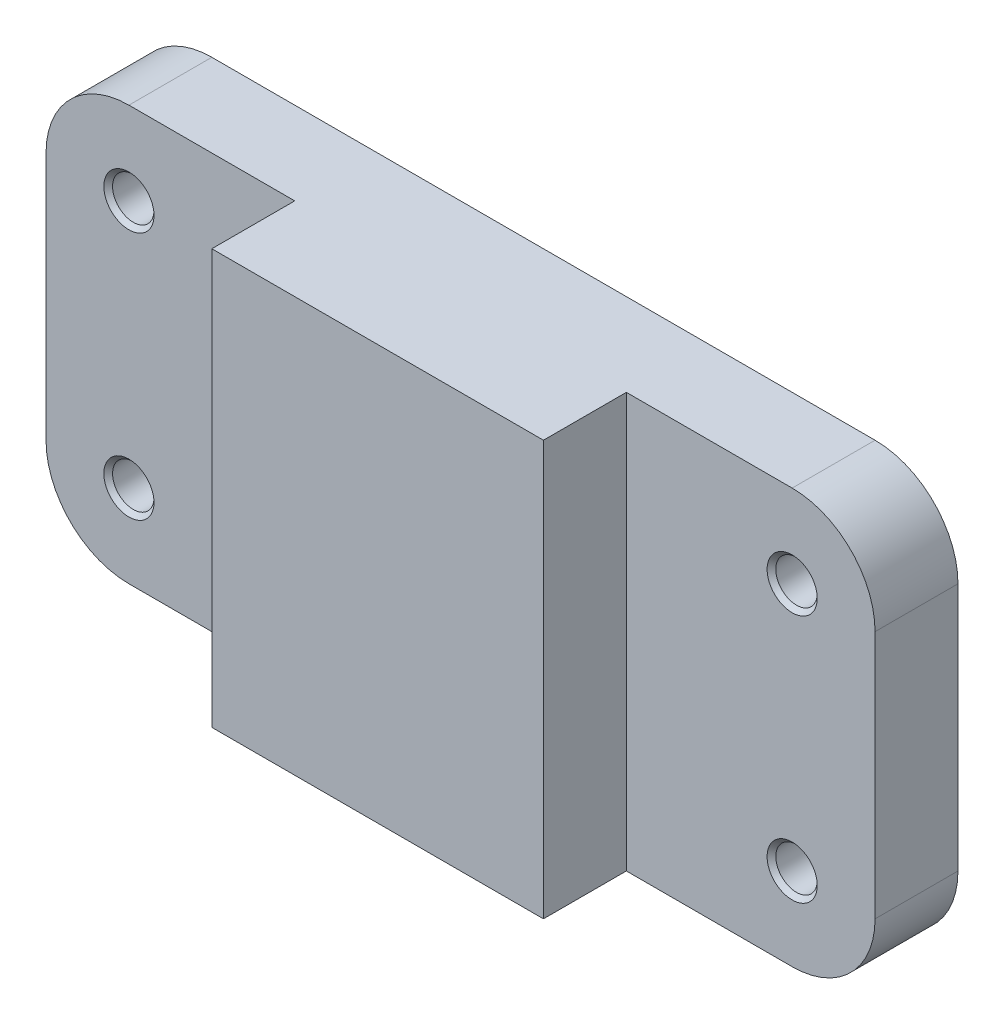
ISO-10303-21;
HEADER;
FILE_DESCRIPTION(('STEP AP214'),'2;1');
FILE_NAME('part.step','',(''),(''),'','','');
FILE_SCHEMA(('AUTOMOTIVE_DESIGN { 1 0 10303 214 1 1 1 1 }'));
ENDSEC;
DATA;
#1=APPLICATION_CONTEXT('core data for automotive mechanical design processes');
#2=APPLICATION_PROTOCOL_DEFINITION('international standard','automotive_design',2000,#1);
#3=PRODUCT_CONTEXT('',#1,'mechanical');
#4=PRODUCT('Part','Part','',(#3));
#5=PRODUCT_RELATED_PRODUCT_CATEGORY('part','',(#4));
#6=PRODUCT_DEFINITION_FORMATION('','',#4);
#7=PRODUCT_DEFINITION_CONTEXT('part definition',#1,'design');
#8=PRODUCT_DEFINITION('design','',#6,#7);
#9=PRODUCT_DEFINITION_SHAPE('','',#8);
#10=(LENGTH_UNIT() NAMED_UNIT(*) SI_UNIT(.MILLI.,.METRE.));
#11=(NAMED_UNIT(*) PLANE_ANGLE_UNIT() SI_UNIT($,.RADIAN.));
#12=(NAMED_UNIT(*) SI_UNIT($,.STERADIAN.) SOLID_ANGLE_UNIT());
#13=UNCERTAINTY_MEASURE_WITH_UNIT(LENGTH_MEASURE(1.E-05),#10,'distance_accuracy_value','');
#14=(GEOMETRIC_REPRESENTATION_CONTEXT(3) GLOBAL_UNCERTAINTY_ASSIGNED_CONTEXT((#13)) GLOBAL_UNIT_ASSIGNED_CONTEXT((#10,
#11,#12)) REPRESENTATION_CONTEXT('',''));
#15=CARTESIAN_POINT('',(0.,0.,0.));
#16=DIRECTION('',(0.,0.,1.));
#17=DIRECTION('',(1.,0.,0.));
#18=AXIS2_PLACEMENT_3D('',#15,#16,#17);
#19=CARTESIAN_POINT('',(0.,0.,10.));
#20=DIRECTION('',(0.,0.,1.));
#21=DIRECTION('',(1.,0.,0.));
#22=AXIS2_PLACEMENT_3D('',#19,#20,#21);
#23=PLANE('',#22);
#24=CARTESIAN_POINT('',(40.,-15.,10.));
#25=DIRECTION('',(0.,0.,1.));
#26=DIRECTION('',(1.,0.,0.));
#27=AXIS2_PLACEMENT_3D('',#24,#25,#26);
#28=CIRCLE('',#27,3.025);
#29=CARTESIAN_POINT('',(43.025,-15.,10.));
#30=VERTEX_POINT('',#29);
#31=EDGE_CURVE('E267',#30,#30,#28,.T.);
#32=ORIENTED_EDGE('',*,*,#31,.F.);
#33=EDGE_LOOP('',(#32));
#34=FACE_BOUND('',#33,.T.);
#35=CARTESIAN_POINT('',(40.,15.,10.));
#36=DIRECTION('',(0.,0.,1.));
#37=DIRECTION('',(1.,0.,0.));
#38=AXIS2_PLACEMENT_3D('',#35,#36,#37);
#39=CIRCLE('',#38,3.025);
#40=CARTESIAN_POINT('',(43.025,15.,10.));
#41=VERTEX_POINT('',#40);
#42=EDGE_CURVE('E258',#41,#41,#39,.T.);
#43=ORIENTED_EDGE('',*,*,#42,.F.);
#44=EDGE_LOOP('',(#43));
#45=FACE_BOUND('',#44,.T.);
#46=DIRECTION('',(1.,0.,0.));
#47=VECTOR('',#46,1.);
#48=CARTESIAN_POINT('',(-50.,-25.,10.));
#49=LINE('',#48,#47);
#50=CARTESIAN_POINT('',(20.,-25.,10.));
#51=VERTEX_POINT('',#50);
#52=CARTESIAN_POINT('',(40.,-25.,10.));
#53=VERTEX_POINT('',#52);
#54=EDGE_CURVE('E170',#51,#53,#49,.T.);
#55=ORIENTED_EDGE('',*,*,#54,.T.);
#56=CARTESIAN_POINT('',(40.,-15.,10.));
#57=DIRECTION('',(0.,0.,1.));
#58=DIRECTION('',(1.,0.,0.));
#59=AXIS2_PLACEMENT_3D('',#56,#57,#58);
#60=CIRCLE('',#59,10.);
#61=CARTESIAN_POINT('',(50.,-15.,10.));
#62=VERTEX_POINT('',#61);
#63=EDGE_CURVE('E198',#53,#62,#60,.T.);
#64=ORIENTED_EDGE('',*,*,#63,.T.);
#65=DIRECTION('',(0.,1.,0.));
#66=VECTOR('',#65,1.);
#67=CARTESIAN_POINT('',(50.,25.,10.));
#68=LINE('',#67,#66);
#69=CARTESIAN_POINT('',(50.,15.,10.));
#70=VERTEX_POINT('',#69);
#71=EDGE_CURVE('E161',#62,#70,#68,.T.);
#72=ORIENTED_EDGE('',*,*,#71,.T.);
#73=CARTESIAN_POINT('',(40.,15.,10.));
#74=DIRECTION('',(0.,0.,1.));
#75=DIRECTION('',(1.,0.,0.));
#76=AXIS2_PLACEMENT_3D('',#73,#74,#75);
#77=CIRCLE('',#76,10.);
#78=CARTESIAN_POINT('',(40.,25.,10.));
#79=VERTEX_POINT('',#78);
#80=EDGE_CURVE('E196',#70,#79,#77,.T.);
#81=ORIENTED_EDGE('',*,*,#80,.T.);
#82=DIRECTION('',(-1.,0.,0.));
#83=VECTOR('',#82,1.);
#84=CARTESIAN_POINT('',(-50.,25.,10.));
#85=LINE('',#84,#83);
#86=CARTESIAN_POINT('',(20.,25.,10.));
#87=VERTEX_POINT('',#86);
#88=EDGE_CURVE('E166',#79,#87,#85,.T.);
#89=ORIENTED_EDGE('',*,*,#88,.T.);
#90=DIRECTION('',(0.,1.,0.));
#91=VECTOR('',#90,1.);
#92=CARTESIAN_POINT('',(20.,25.,10.));
#93=LINE('',#92,#91);
#94=EDGE_CURVE('E151',#51,#87,#93,.T.);
#95=ORIENTED_EDGE('',*,*,#94,.F.);
#96=EDGE_LOOP('',(#55,#64,#72,#81,#89,#95));
#97=FACE_BOUND('',#96,.T.);
#98=ADVANCED_FACE('F36',(#34,#45,#97),#23,.T.);
#99=CARTESIAN_POINT('',(50.,25.,10.));
#100=DIRECTION('',(-1.,0.,0.));
#101=DIRECTION('',(0.,0.,1.));
#102=AXIS2_PLACEMENT_3D('',#99,#100,#101);
#103=PLANE('',#102);
#104=ORIENTED_EDGE('',*,*,#71,.F.);
#105=DIRECTION('',(0.,0.,-1.));
#106=VECTOR('',#105,1.);
#107=CARTESIAN_POINT('',(50.,-15.,10.));
#108=LINE('',#107,#106);
#109=CARTESIAN_POINT('',(50.,-15.,0.));
#110=VERTEX_POINT('',#109);
#111=EDGE_CURVE('E180',#62,#110,#108,.T.);
#112=ORIENTED_EDGE('',*,*,#111,.T.);
#113=DIRECTION('',(0.,1.,0.));
#114=VECTOR('',#113,1.);
#115=CARTESIAN_POINT('',(50.,25.,0.));
#116=LINE('',#115,#114);
#117=CARTESIAN_POINT('',(50.,15.,0.));
#118=VERTEX_POINT('',#117);
#119=EDGE_CURVE('E152',#110,#118,#116,.T.);
#120=ORIENTED_EDGE('',*,*,#119,.T.);
#121=DIRECTION('',(0.,0.,-1.));
#122=VECTOR('',#121,1.);
#123=CARTESIAN_POINT('',(50.,15.,10.));
#124=LINE('',#123,#122);
#125=EDGE_CURVE('E172',#118,#70,#124,.F.);
#126=ORIENTED_EDGE('',*,*,#125,.T.);
#127=EDGE_LOOP('',(#104,#112,#120,#126));
#128=FACE_BOUND('',#127,.T.);
#129=ADVANCED_FACE('F236',(#128),#103,.F.);
#130=CARTESIAN_POINT('',(-50.,25.,10.));
#131=DIRECTION('',(0.,-1.,0.));
#132=DIRECTION('',(0.,0.,-1.));
#133=AXIS2_PLACEMENT_3D('',#130,#131,#132);
#134=PLANE('',#133);
#135=DIRECTION('',(-1.,0.,0.));
#136=VECTOR('',#135,1.);
#137=CARTESIAN_POINT('',(-50.,25.,0.));
#138=LINE('',#137,#136);
#139=CARTESIAN_POINT('',(40.,25.,0.));
#140=VERTEX_POINT('',#139);
#141=CARTESIAN_POINT('',(-40.,25.,0.));
#142=VERTEX_POINT('',#141);
#143=EDGE_CURVE('E155',#140,#142,#138,.T.);
#144=ORIENTED_EDGE('',*,*,#143,.T.);
#145=DIRECTION('',(0.,0.,-1.));
#146=VECTOR('',#145,1.);
#147=CARTESIAN_POINT('',(-40.,25.,10.));
#148=LINE('',#147,#146);
#149=CARTESIAN_POINT('',(-40.,25.,10.));
#150=VERTEX_POINT('',#149);
#151=EDGE_CURVE('E51',#142,#150,#148,.F.);
#152=ORIENTED_EDGE('',*,*,#151,.T.);
#153=CARTESIAN_POINT('',(-20.,25.,10.));
#154=VERTEX_POINT('',#153);
#155=EDGE_CURVE('E164',#154,#150,#85,.T.);
#156=ORIENTED_EDGE('',*,*,#155,.F.);
#157=DIRECTION('',(0.,0.,-1.));
#158=VECTOR('',#157,1.);
#159=CARTESIAN_POINT('',(-20.,25.,20.));
#160=LINE('',#159,#158);
#161=CARTESIAN_POINT('',(-20.,25.,20.));
#162=VERTEX_POINT('',#161);
#163=EDGE_CURVE('E135',#162,#154,#160,.T.);
#164=ORIENTED_EDGE('',*,*,#163,.F.);
#165=DIRECTION('',(-1.,0.,0.));
#166=VECTOR('',#165,1.);
#167=CARTESIAN_POINT('',(-20.,25.,20.));
#168=LINE('',#167,#166);
#169=CARTESIAN_POINT('',(20.,25.,20.));
#170=VERTEX_POINT('',#169);
#171=EDGE_CURVE('E127',#170,#162,#168,.T.);
#172=ORIENTED_EDGE('',*,*,#171,.F.);
#173=DIRECTION('',(0.,0.,-1.));
#174=VECTOR('',#173,1.);
#175=CARTESIAN_POINT('',(20.,25.,20.));
#176=LINE('',#175,#174);
#177=EDGE_CURVE('E132',#170,#87,#176,.T.);
#178=ORIENTED_EDGE('',*,*,#177,.T.);
#179=ORIENTED_EDGE('',*,*,#88,.F.);
#180=DIRECTION('',(0.,0.,-1.));
#181=VECTOR('',#180,1.);
#182=CARTESIAN_POINT('',(40.,25.,10.));
#183=LINE('',#182,#181);
#184=EDGE_CURVE('E204',#79,#140,#183,.T.);
#185=ORIENTED_EDGE('',*,*,#184,.T.);
#186=EDGE_LOOP('',(#144,#152,#156,#164,#172,#178,#179,#185));
#187=FACE_BOUND('',#186,.T.);
#188=ADVANCED_FACE('F129',(#187),#134,.F.);
#189=CARTESIAN_POINT('',(-50.,25.,10.));
#190=DIRECTION('',(1.,0.,0.));
#191=DIRECTION('',(0.,0.,-1.));
#192=AXIS2_PLACEMENT_3D('',#189,#190,#191);
#193=PLANE('',#192);
#194=DIRECTION('',(0.,-1.,0.));
#195=VECTOR('',#194,1.);
#196=CARTESIAN_POINT('',(-50.,25.,10.));
#197=LINE('',#196,#195);
#198=CARTESIAN_POINT('',(-50.,15.,10.));
#199=VERTEX_POINT('',#198);
#200=CARTESIAN_POINT('',(-50.,-15.,10.));
#201=VERTEX_POINT('',#200);
#202=EDGE_CURVE('E168',#199,#201,#197,.T.);
#203=ORIENTED_EDGE('',*,*,#202,.F.);
#204=DIRECTION('',(0.,0.,-1.));
#205=VECTOR('',#204,1.);
#206=CARTESIAN_POINT('',(-50.,15.,10.));
#207=LINE('',#206,#205);
#208=CARTESIAN_POINT('',(-50.,15.,0.));
#209=VERTEX_POINT('',#208);
#210=EDGE_CURVE('E201',#199,#209,#207,.T.);
#211=ORIENTED_EDGE('',*,*,#210,.T.);
#212=DIRECTION('',(0.,-1.,0.));
#213=VECTOR('',#212,1.);
#214=CARTESIAN_POINT('',(-50.,25.,0.));
#215=LINE('',#214,#213);
#216=CARTESIAN_POINT('',(-50.,-15.,0.));
#217=VERTEX_POINT('',#216);
#218=EDGE_CURVE('E175',#209,#217,#215,.T.);
#219=ORIENTED_EDGE('',*,*,#218,.T.);
#220=DIRECTION('',(0.,0.,-1.));
#221=VECTOR('',#220,1.);
#222=CARTESIAN_POINT('',(-50.,-15.,10.));
#223=LINE('',#222,#221);
#224=EDGE_CURVE('E59',#217,#201,#223,.F.);
#225=ORIENTED_EDGE('',*,*,#224,.T.);
#226=EDGE_LOOP('',(#203,#211,#219,#225));
#227=FACE_BOUND('',#226,.T.);
#228=ADVANCED_FACE('F223',(#227),#193,.F.);
#229=CARTESIAN_POINT('',(-50.,-25.,10.));
#230=DIRECTION('',(0.,1.,0.));
#231=DIRECTION('',(0.,0.,1.));
#232=AXIS2_PLACEMENT_3D('',#229,#230,#231);
#233=PLANE('',#232);
#234=DIRECTION('',(1.,0.,0.));
#235=VECTOR('',#234,1.);
#236=CARTESIAN_POINT('',(-50.,-25.,0.));
#237=LINE('',#236,#235);
#238=CARTESIAN_POINT('',(-40.,-25.,0.));
#239=VERTEX_POINT('',#238);
#240=CARTESIAN_POINT('',(40.,-25.,0.));
#241=VERTEX_POINT('',#240);
#242=EDGE_CURVE('E165',#239,#241,#237,.T.);
#243=ORIENTED_EDGE('',*,*,#242,.T.);
#244=DIRECTION('',(0.,0.,-1.));
#245=VECTOR('',#244,1.);
#246=CARTESIAN_POINT('',(40.,-25.,10.));
#247=LINE('',#246,#245);
#248=EDGE_CURVE('E194',#241,#53,#247,.F.);
#249=ORIENTED_EDGE('',*,*,#248,.T.);
#250=ORIENTED_EDGE('',*,*,#54,.F.);
#251=DIRECTION('',(0.,0.,-1.));
#252=VECTOR('',#251,1.);
#253=CARTESIAN_POINT('',(20.,-25.,20.));
#254=LINE('',#253,#252);
#255=CARTESIAN_POINT('',(20.,-25.,20.));
#256=VERTEX_POINT('',#255);
#257=EDGE_CURVE('E254',#256,#51,#254,.T.);
#258=ORIENTED_EDGE('',*,*,#257,.F.);
#259=DIRECTION('',(1.,0.,0.));
#260=VECTOR('',#259,1.);
#261=CARTESIAN_POINT('',(-20.,-25.,20.));
#262=LINE('',#261,#260);
#263=CARTESIAN_POINT('',(-20.,-25.,20.));
#264=VERTEX_POINT('',#263);
#265=EDGE_CURVE('E144',#264,#256,#262,.T.);
#266=ORIENTED_EDGE('',*,*,#265,.F.);
#267=DIRECTION('',(0.,0.,-1.));
#268=VECTOR('',#267,1.);
#269=CARTESIAN_POINT('',(-20.,-25.,20.));
#270=LINE('',#269,#268);
#271=CARTESIAN_POINT('',(-20.,-25.,10.));
#272=VERTEX_POINT('',#271);
#273=EDGE_CURVE('E157',#264,#272,#270,.T.);
#274=ORIENTED_EDGE('',*,*,#273,.T.);
#275=CARTESIAN_POINT('',(-40.,-25.,10.));
#276=VERTEX_POINT('',#275);
#277=EDGE_CURVE('E171',#276,#272,#49,.T.);
#278=ORIENTED_EDGE('',*,*,#277,.F.);
#279=DIRECTION('',(0.,0.,-1.));
#280=VECTOR('',#279,1.);
#281=CARTESIAN_POINT('',(-40.,-25.,10.));
#282=LINE('',#281,#280);
#283=EDGE_CURVE('E191',#276,#239,#282,.T.);
#284=ORIENTED_EDGE('',*,*,#283,.T.);
#285=EDGE_LOOP('',(#243,#249,#250,#258,#266,#274,#278,#284));
#286=FACE_BOUND('',#285,.T.);
#287=ADVANCED_FACE('F216',(#286),#233,.F.);
#288=CARTESIAN_POINT('',(-40.,15.,10.));
#289=DIRECTION('',(0.,0.,1.));
#290=DIRECTION('',(1.,0.,0.));
#291=AXIS2_PLACEMENT_3D('',#288,#289,#290);
#292=CIRCLE('',#291,3.025);
#293=CARTESIAN_POINT('',(-36.975,15.,10.));
#294=VERTEX_POINT('',#293);
#295=EDGE_CURVE('E285',#294,#294,#292,.T.);
#296=ORIENTED_EDGE('',*,*,#295,.F.);
#297=EDGE_LOOP('',(#296));
#298=FACE_BOUND('',#297,.T.);
#299=CARTESIAN_POINT('',(-40.,-15.,10.));
#300=DIRECTION('',(0.,0.,1.));
#301=DIRECTION('',(1.,0.,0.));
#302=AXIS2_PLACEMENT_3D('',#299,#300,#301);
#303=CIRCLE('',#302,3.025);
#304=CARTESIAN_POINT('',(-36.975,-15.,10.));
#305=VERTEX_POINT('',#304);
#306=EDGE_CURVE('E276',#305,#305,#303,.T.);
#307=ORIENTED_EDGE('',*,*,#306,.F.);
#308=EDGE_LOOP('',(#307));
#309=FACE_BOUND('',#308,.T.);
#310=ORIENTED_EDGE('',*,*,#155,.T.);
#311=CARTESIAN_POINT('',(-40.,15.,10.));
#312=DIRECTION('',(0.,0.,1.));
#313=DIRECTION('',(1.,0.,0.));
#314=AXIS2_PLACEMENT_3D('',#311,#312,#313);
#315=CIRCLE('',#314,10.);
#316=EDGE_CURVE('E11',#150,#199,#315,.T.);
#317=ORIENTED_EDGE('',*,*,#316,.T.);
#318=ORIENTED_EDGE('',*,*,#202,.T.);
#319=CARTESIAN_POINT('',(-40.,-15.,10.));
#320=DIRECTION('',(0.,0.,1.));
#321=DIRECTION('',(1.,0.,0.));
#322=AXIS2_PLACEMENT_3D('',#319,#320,#321);
#323=CIRCLE('',#322,10.);
#324=EDGE_CURVE('E44',#201,#276,#323,.T.);
#325=ORIENTED_EDGE('',*,*,#324,.T.);
#326=ORIENTED_EDGE('',*,*,#277,.T.);
#327=DIRECTION('',(0.,-1.,0.));
#328=VECTOR('',#327,1.);
#329=CARTESIAN_POINT('',(-20.,25.,10.));
#330=LINE('',#329,#328);
#331=EDGE_CURVE('E148',#154,#272,#330,.T.);
#332=ORIENTED_EDGE('',*,*,#331,.F.);
#333=EDGE_LOOP('',(#310,#317,#318,#325,#326,#332));
#334=FACE_BOUND('',#333,.T.);
#335=ADVANCED_FACE('F210',(#298,#309,#334),#23,.T.);
#336=CARTESIAN_POINT('',(0.,0.,0.));
#337=DIRECTION('',(0.,0.,1.));
#338=DIRECTION('',(1.,0.,0.));
#339=AXIS2_PLACEMENT_3D('',#336,#337,#338);
#340=PLANE('',#339);
#341=CARTESIAN_POINT('',(-40.,15.,0.));
#342=DIRECTION('',(0.,0.,1.));
#343=DIRECTION('',(1.,0.,0.));
#344=AXIS2_PLACEMENT_3D('',#341,#342,#343);
#345=CIRCLE('',#344,2.5);
#346=CARTESIAN_POINT('',(-37.5,15.,0.));
#347=VERTEX_POINT('',#346);
#348=EDGE_CURVE('E279',#347,#347,#345,.T.);
#349=ORIENTED_EDGE('',*,*,#348,.T.);
#350=EDGE_LOOP('',(#349));
#351=FACE_BOUND('',#350,.T.);
#352=CARTESIAN_POINT('',(-40.,-15.,0.));
#353=DIRECTION('',(0.,0.,1.));
#354=DIRECTION('',(1.,0.,0.));
#355=AXIS2_PLACEMENT_3D('',#352,#353,#354);
#356=CIRCLE('',#355,2.5);
#357=CARTESIAN_POINT('',(-37.5,-15.,0.));
#358=VERTEX_POINT('',#357);
#359=EDGE_CURVE('E270',#358,#358,#356,.T.);
#360=ORIENTED_EDGE('',*,*,#359,.T.);
#361=EDGE_LOOP('',(#360));
#362=FACE_BOUND('',#361,.T.);
#363=CARTESIAN_POINT('',(40.,-15.,0.));
#364=DIRECTION('',(0.,0.,1.));
#365=DIRECTION('',(1.,0.,0.));
#366=AXIS2_PLACEMENT_3D('',#363,#364,#365);
#367=CIRCLE('',#366,2.5);
#368=CARTESIAN_POINT('',(42.5,-15.,0.));
#369=VERTEX_POINT('',#368);
#370=EDGE_CURVE('E261',#369,#369,#367,.T.);
#371=ORIENTED_EDGE('',*,*,#370,.T.);
#372=EDGE_LOOP('',(#371));
#373=FACE_BOUND('',#372,.T.);
#374=CARTESIAN_POINT('',(40.,15.,0.));
#375=DIRECTION('',(0.,0.,1.));
#376=DIRECTION('',(1.,0.,0.));
#377=AXIS2_PLACEMENT_3D('',#374,#375,#376);
#378=CIRCLE('',#377,2.5);
#379=CARTESIAN_POINT('',(42.5,15.,0.));
#380=VERTEX_POINT('',#379);
#381=EDGE_CURVE('E245',#380,#380,#378,.T.);
#382=ORIENTED_EDGE('',*,*,#381,.T.);
#383=EDGE_LOOP('',(#382));
#384=FACE_BOUND('',#383,.T.);
#385=ORIENTED_EDGE('',*,*,#119,.F.);
#386=CARTESIAN_POINT('',(40.,-15.,0.));
#387=DIRECTION('',(0.,0.,1.));
#388=DIRECTION('',(1.,0.,0.));
#389=AXIS2_PLACEMENT_3D('',#386,#387,#388);
#390=CIRCLE('',#389,10.);
#391=EDGE_CURVE('E189',#110,#241,#390,.F.);
#392=ORIENTED_EDGE('',*,*,#391,.T.);
#393=ORIENTED_EDGE('',*,*,#242,.F.);
#394=CARTESIAN_POINT('',(-40.,-15.,0.));
#395=DIRECTION('',(0.,0.,1.));
#396=DIRECTION('',(1.,0.,0.));
#397=AXIS2_PLACEMENT_3D('',#394,#395,#396);
#398=CIRCLE('',#397,10.);
#399=EDGE_CURVE('E183',#239,#217,#398,.F.);
#400=ORIENTED_EDGE('',*,*,#399,.T.);
#401=ORIENTED_EDGE('',*,*,#218,.F.);
#402=CARTESIAN_POINT('',(-40.,15.,0.));
#403=DIRECTION('',(0.,0.,1.));
#404=DIRECTION('',(1.,0.,0.));
#405=AXIS2_PLACEMENT_3D('',#402,#403,#404);
#406=CIRCLE('',#405,10.);
#407=EDGE_CURVE('E187',#209,#142,#406,.F.);
#408=ORIENTED_EDGE('',*,*,#407,.T.);
#409=ORIENTED_EDGE('',*,*,#143,.F.);
#410=CARTESIAN_POINT('',(40.,15.,0.));
#411=DIRECTION('',(0.,0.,1.));
#412=DIRECTION('',(1.,0.,0.));
#413=AXIS2_PLACEMENT_3D('',#410,#411,#412);
#414=CIRCLE('',#413,10.);
#415=EDGE_CURVE('E185',#140,#118,#414,.F.);
#416=ORIENTED_EDGE('',*,*,#415,.T.);
#417=EDGE_LOOP('',(#385,#392,#393,#400,#401,#408,#409,#416));
#418=FACE_BOUND('',#417,.T.);
#419=ADVANCED_FACE('F222',(#351,#362,#373,#384,#418),#340,.F.);
#420=CARTESIAN_POINT('',(20.,25.,20.));
#421=DIRECTION('',(-1.,0.,0.));
#422=DIRECTION('',(0.,0.,1.));
#423=AXIS2_PLACEMENT_3D('',#420,#421,#422);
#424=PLANE('',#423);
#425=ORIENTED_EDGE('',*,*,#94,.T.);
#426=ORIENTED_EDGE('',*,*,#177,.F.);
#427=DIRECTION('',(0.,1.,0.));
#428=VECTOR('',#427,1.);
#429=CARTESIAN_POINT('',(20.,25.,20.));
#430=LINE('',#429,#428);
#431=EDGE_CURVE('E139',#256,#170,#430,.T.);
#432=ORIENTED_EDGE('',*,*,#431,.F.);
#433=ORIENTED_EDGE('',*,*,#257,.T.);
#434=EDGE_LOOP('',(#425,#426,#432,#433));
#435=FACE_BOUND('',#434,.T.);
#436=ADVANCED_FACE('F150',(#435),#424,.F.);
#437=CARTESIAN_POINT('',(-20.,25.,20.));
#438=DIRECTION('',(1.,0.,0.));
#439=DIRECTION('',(0.,0.,-1.));
#440=AXIS2_PLACEMENT_3D('',#437,#438,#439);
#441=PLANE('',#440);
#442=ORIENTED_EDGE('',*,*,#331,.T.);
#443=ORIENTED_EDGE('',*,*,#273,.F.);
#444=DIRECTION('',(0.,-1.,0.));
#445=VECTOR('',#444,1.);
#446=CARTESIAN_POINT('',(-20.,25.,20.));
#447=LINE('',#446,#445);
#448=EDGE_CURVE('E138',#162,#264,#447,.T.);
#449=ORIENTED_EDGE('',*,*,#448,.F.);
#450=ORIENTED_EDGE('',*,*,#163,.T.);
#451=EDGE_LOOP('',(#442,#443,#449,#450));
#452=FACE_BOUND('',#451,.T.);
#453=ADVANCED_FACE('F357',(#452),#441,.F.);
#454=CARTESIAN_POINT('',(0.,0.,20.));
#455=DIRECTION('',(0.,0.,1.));
#456=DIRECTION('',(1.,0.,0.));
#457=AXIS2_PLACEMENT_3D('',#454,#455,#456);
#458=PLANE('',#457);
#459=ORIENTED_EDGE('',*,*,#431,.T.);
#460=ORIENTED_EDGE('',*,*,#171,.T.);
#461=ORIENTED_EDGE('',*,*,#448,.T.);
#462=ORIENTED_EDGE('',*,*,#265,.T.);
#463=EDGE_LOOP('',(#459,#460,#461,#462));
#464=FACE_BOUND('',#463,.T.);
#465=ADVANCED_FACE('F142',(#464),#458,.T.);
#466=CARTESIAN_POINT('',(40.,-15.,10.));
#467=DIRECTION('',(0.,0.,-1.));
#468=DIRECTION('',(-1.,0.,0.));
#469=AXIS2_PLACEMENT_3D('',#466,#467,#468);
#470=CYLINDRICAL_SURFACE('',#469,10.);
#471=ORIENTED_EDGE('',*,*,#63,.F.);
#472=ORIENTED_EDGE('',*,*,#248,.F.);
#473=ORIENTED_EDGE('',*,*,#391,.F.);
#474=ORIENTED_EDGE('',*,*,#111,.F.);
#475=EDGE_LOOP('',(#471,#472,#473,#474));
#476=FACE_BOUND('',#475,.T.);
#477=ADVANCED_FACE('F240',(#476),#470,.T.);
#478=CARTESIAN_POINT('',(-40.,15.,10.));
#479=DIRECTION('',(0.,0.,-1.));
#480=DIRECTION('',(-1.,0.,0.));
#481=AXIS2_PLACEMENT_3D('',#478,#479,#480);
#482=CYLINDRICAL_SURFACE('',#481,10.);
#483=ORIENTED_EDGE('',*,*,#316,.F.);
#484=ORIENTED_EDGE('',*,*,#151,.F.);
#485=ORIENTED_EDGE('',*,*,#407,.F.);
#486=ORIENTED_EDGE('',*,*,#210,.F.);
#487=EDGE_LOOP('',(#483,#484,#485,#486));
#488=FACE_BOUND('',#487,.T.);
#489=ADVANCED_FACE('F227',(#488),#482,.T.);
#490=CARTESIAN_POINT('',(40.,15.,10.));
#491=DIRECTION('',(0.,0.,-1.));
#492=DIRECTION('',(-1.,0.,0.));
#493=AXIS2_PLACEMENT_3D('',#490,#491,#492);
#494=CYLINDRICAL_SURFACE('',#493,10.);
#495=ORIENTED_EDGE('',*,*,#80,.F.);
#496=ORIENTED_EDGE('',*,*,#125,.F.);
#497=ORIENTED_EDGE('',*,*,#415,.F.);
#498=ORIENTED_EDGE('',*,*,#184,.F.);
#499=EDGE_LOOP('',(#495,#496,#497,#498));
#500=FACE_BOUND('',#499,.T.);
#501=ADVANCED_FACE('F232',(#500),#494,.T.);
#502=CARTESIAN_POINT('',(-40.,-15.,10.));
#503=DIRECTION('',(0.,0.,-1.));
#504=DIRECTION('',(-1.,0.,0.));
#505=AXIS2_PLACEMENT_3D('',#502,#503,#504);
#506=CYLINDRICAL_SURFACE('',#505,10.);
#507=ORIENTED_EDGE('',*,*,#324,.F.);
#508=ORIENTED_EDGE('',*,*,#224,.F.);
#509=ORIENTED_EDGE('',*,*,#399,.F.);
#510=ORIENTED_EDGE('',*,*,#283,.F.);
#511=EDGE_LOOP('',(#507,#508,#509,#510));
#512=FACE_BOUND('',#511,.T.);
#513=ADVANCED_FACE('F38',(#512),#506,.T.);
#514=CARTESIAN_POINT('',(40.,15.,10.));
#515=DIRECTION('',(0.,0.,1.));
#516=DIRECTION('',(1.,0.,0.));
#517=AXIS2_PLACEMENT_3D('',#514,#515,#516);
#518=CYLINDRICAL_SURFACE('',#517,2.5);
#519=ORIENTED_EDGE('',*,*,#381,.F.);
#520=EDGE_LOOP('',(#519));
#521=FACE_BOUND('',#520,.T.);
#522=CARTESIAN_POINT('',(40.,15.,9.475));
#523=DIRECTION('',(0.,0.,1.));
#524=DIRECTION('',(1.,0.,0.));
#525=AXIS2_PLACEMENT_3D('',#522,#523,#524);
#526=CIRCLE('',#525,2.5);
#527=CARTESIAN_POINT('',(42.5,15.,9.475));
#528=VERTEX_POINT('',#527);
#529=EDGE_CURVE('E249',#528,#528,#526,.T.);
#530=ORIENTED_EDGE('',*,*,#529,.T.);
#531=EDGE_LOOP('',(#530));
#532=FACE_BOUND('',#531,.T.);
#533=ADVANCED_FACE('F339',(#521,#532),#518,.F.);
#534=CARTESIAN_POINT('',(40.,15.,10.));
#535=DIRECTION('',(0.,0.,1.));
#536=DIRECTION('',(1.,0.,0.));
#537=AXIS2_PLACEMENT_3D('',#534,#535,#536);
#538=CONICAL_SURFACE('',#537,3.025,0.785398163397452);
#539=ORIENTED_EDGE('',*,*,#529,.F.);
#540=EDGE_LOOP('',(#539));
#541=FACE_BOUND('',#540,.T.);
#542=ORIENTED_EDGE('',*,*,#42,.T.);
#543=EDGE_LOOP('',(#542));
#544=FACE_BOUND('',#543,.T.);
#545=ADVANCED_FACE('F343',(#541,#544),#538,.F.);
#546=CARTESIAN_POINT('',(40.,-15.,10.));
#547=DIRECTION('',(0.,0.,1.));
#548=DIRECTION('',(1.,0.,0.));
#549=AXIS2_PLACEMENT_3D('',#546,#547,#548);
#550=CYLINDRICAL_SURFACE('',#549,2.5);
#551=ORIENTED_EDGE('',*,*,#370,.F.);
#552=EDGE_LOOP('',(#551));
#553=FACE_BOUND('',#552,.T.);
#554=CARTESIAN_POINT('',(40.,-15.,9.475));
#555=DIRECTION('',(0.,0.,1.));
#556=DIRECTION('',(1.,0.,0.));
#557=AXIS2_PLACEMENT_3D('',#554,#555,#556);
#558=CIRCLE('',#557,2.5);
#559=CARTESIAN_POINT('',(42.5,-15.,9.475));
#560=VERTEX_POINT('',#559);
#561=EDGE_CURVE('E264',#560,#560,#558,.T.);
#562=ORIENTED_EDGE('',*,*,#561,.T.);
#563=EDGE_LOOP('',(#562));
#564=FACE_BOUND('',#563,.T.);
#565=ADVANCED_FACE('F349',(#553,#564),#550,.F.);
#566=CARTESIAN_POINT('',(40.,-15.,10.));
#567=DIRECTION('',(0.,0.,1.));
#568=DIRECTION('',(1.,0.,0.));
#569=AXIS2_PLACEMENT_3D('',#566,#567,#568);
#570=CONICAL_SURFACE('',#569,3.025,0.785398163397452);
#571=ORIENTED_EDGE('',*,*,#561,.F.);
#572=EDGE_LOOP('',(#571));
#573=FACE_BOUND('',#572,.T.);
#574=ORIENTED_EDGE('',*,*,#31,.T.);
#575=EDGE_LOOP('',(#574));
#576=FACE_BOUND('',#575,.T.);
#577=ADVANCED_FACE('F308',(#573,#576),#570,.F.);
#578=CARTESIAN_POINT('',(-40.,-15.,10.));
#579=DIRECTION('',(0.,0.,1.));
#580=DIRECTION('',(1.,0.,0.));
#581=AXIS2_PLACEMENT_3D('',#578,#579,#580);
#582=CYLINDRICAL_SURFACE('',#581,2.5);
#583=ORIENTED_EDGE('',*,*,#359,.F.);
#584=EDGE_LOOP('',(#583));
#585=FACE_BOUND('',#584,.T.);
#586=CARTESIAN_POINT('',(-40.,-15.,9.475));
#587=DIRECTION('',(0.,0.,1.));
#588=DIRECTION('',(1.,0.,0.));
#589=AXIS2_PLACEMENT_3D('',#586,#587,#588);
#590=CIRCLE('',#589,2.5);
#591=CARTESIAN_POINT('',(-37.5,-15.,9.475));
#592=VERTEX_POINT('',#591);
#593=EDGE_CURVE('E273',#592,#592,#590,.T.);
#594=ORIENTED_EDGE('',*,*,#593,.T.);
#595=EDGE_LOOP('',(#594));
#596=FACE_BOUND('',#595,.T.);
#597=ADVANCED_FACE('F299',(#585,#596),#582,.F.);
#598=CARTESIAN_POINT('',(-40.,-15.,10.));
#599=DIRECTION('',(0.,0.,1.));
#600=DIRECTION('',(1.,0.,0.));
#601=AXIS2_PLACEMENT_3D('',#598,#599,#600);
#602=CONICAL_SURFACE('',#601,3.025,0.785398163397452);
#603=ORIENTED_EDGE('',*,*,#593,.F.);
#604=EDGE_LOOP('',(#603));
#605=FACE_BOUND('',#604,.T.);
#606=ORIENTED_EDGE('',*,*,#306,.T.);
#607=EDGE_LOOP('',(#606));
#608=FACE_BOUND('',#607,.T.);
#609=ADVANCED_FACE('F296',(#605,#608),#602,.F.);
#610=CARTESIAN_POINT('',(-40.,15.,10.));
#611=DIRECTION('',(0.,0.,1.));
#612=DIRECTION('',(1.,0.,0.));
#613=AXIS2_PLACEMENT_3D('',#610,#611,#612);
#614=CYLINDRICAL_SURFACE('',#613,2.5);
#615=ORIENTED_EDGE('',*,*,#348,.F.);
#616=EDGE_LOOP('',(#615));
#617=FACE_BOUND('',#616,.T.);
#618=CARTESIAN_POINT('',(-40.,15.,9.475));
#619=DIRECTION('',(0.,0.,1.));
#620=DIRECTION('',(1.,0.,0.));
#621=AXIS2_PLACEMENT_3D('',#618,#619,#620);
#622=CIRCLE('',#621,2.5);
#623=CARTESIAN_POINT('',(-37.5,15.,9.475));
#624=VERTEX_POINT('',#623);
#625=EDGE_CURVE('E282',#624,#624,#622,.T.);
#626=ORIENTED_EDGE('',*,*,#625,.T.);
#627=EDGE_LOOP('',(#626));
#628=FACE_BOUND('',#627,.T.);
#629=ADVANCED_FACE('F298',(#617,#628),#614,.F.);
#630=CARTESIAN_POINT('',(-40.,15.,10.));
#631=DIRECTION('',(0.,0.,1.));
#632=DIRECTION('',(1.,0.,0.));
#633=AXIS2_PLACEMENT_3D('',#630,#631,#632);
#634=CONICAL_SURFACE('',#633,3.025,0.785398163397452);
#635=ORIENTED_EDGE('',*,*,#625,.F.);
#636=EDGE_LOOP('',(#635));
#637=FACE_BOUND('',#636,.T.);
#638=ORIENTED_EDGE('',*,*,#295,.T.);
#639=EDGE_LOOP('',(#638));
#640=FACE_BOUND('',#639,.T.);
#641=ADVANCED_FACE('F289',(#637,#640),#634,.F.);
#642=CLOSED_SHELL('',(#98,#129,#188,#228,#287,#335,#419,#436,#453,#465,#477,#489,#501,#513,#533,
#545,#565,#577,#597,#609,#629,#641));
#643=MANIFOLD_SOLID_BREP('B2',#642);
#644=ADVANCED_BREP_SHAPE_REPRESENTATION('',(#18,#643),#14);
#645=SHAPE_DEFINITION_REPRESENTATION(#9,#644);
ENDSEC;
END-ISO-10303-21;
